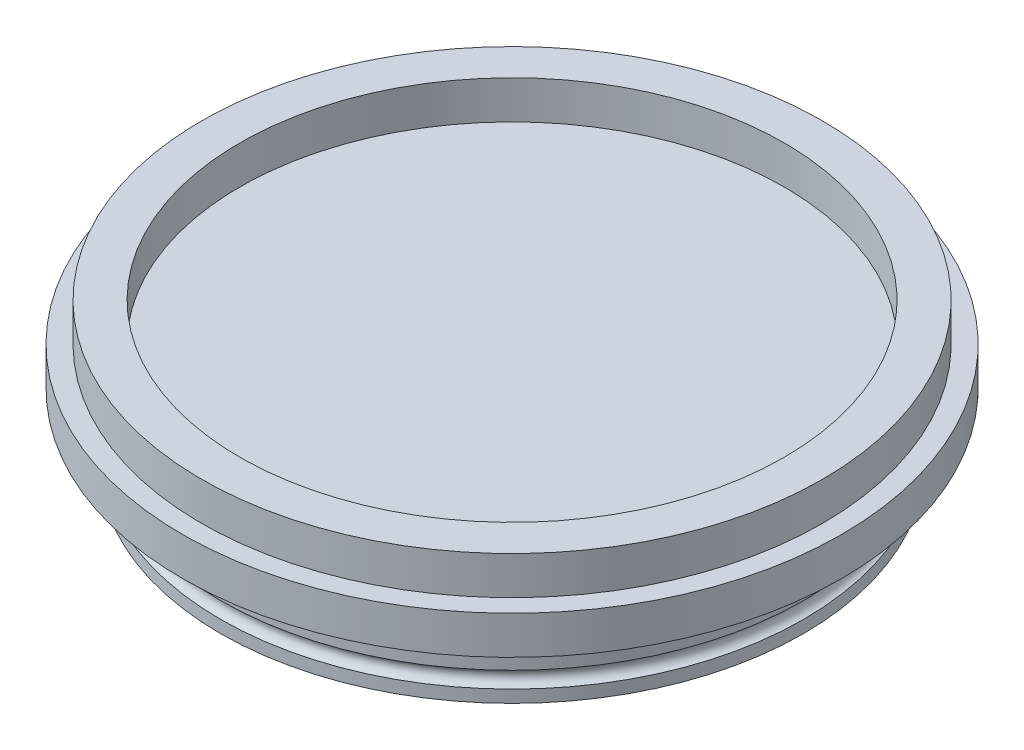
ISO-10303-21;
HEADER;
FILE_DESCRIPTION(('STEP AP214'),'2;1');
FILE_NAME('part.step','',(''),(''),'','','');
FILE_SCHEMA(('AUTOMOTIVE_DESIGN { 1 0 10303 214 1 1 1 1 }'));
ENDSEC;
DATA;
#1=APPLICATION_CONTEXT('core data for automotive mechanical design processes');
#2=APPLICATION_PROTOCOL_DEFINITION('international standard','automotive_design',2000,#1);
#3=PRODUCT_CONTEXT('',#1,'mechanical');
#4=PRODUCT('Part','Part','',(#3));
#5=PRODUCT_RELATED_PRODUCT_CATEGORY('part','',(#4));
#6=PRODUCT_DEFINITION_FORMATION('','',#4);
#7=PRODUCT_DEFINITION_CONTEXT('part definition',#1,'design');
#8=PRODUCT_DEFINITION('design','',#6,#7);
#9=PRODUCT_DEFINITION_SHAPE('','',#8);
#10=(LENGTH_UNIT() NAMED_UNIT(*) SI_UNIT(.MILLI.,.METRE.));
#11=(NAMED_UNIT(*) PLANE_ANGLE_UNIT() SI_UNIT($,.RADIAN.));
#12=(NAMED_UNIT(*) SI_UNIT($,.STERADIAN.) SOLID_ANGLE_UNIT());
#13=UNCERTAINTY_MEASURE_WITH_UNIT(LENGTH_MEASURE(1.E-05),#10,'distance_accuracy_value','');
#14=(GEOMETRIC_REPRESENTATION_CONTEXT(3) GLOBAL_UNCERTAINTY_ASSIGNED_CONTEXT((#13)) GLOBAL_UNIT_ASSIGNED_CONTEXT((#10,
#11,#12)) REPRESENTATION_CONTEXT('',''));
#15=CARTESIAN_POINT('',(0.,0.,0.));
#16=DIRECTION('',(0.,0.,1.));
#17=DIRECTION('',(1.,0.,0.));
#18=AXIS2_PLACEMENT_3D('',#15,#16,#17);
#19=CARTESIAN_POINT('',(0.,0.,0.));
#20=DIRECTION('',(0.,-1.,0.));
#21=DIRECTION('',(1.,0.,0.));
#22=AXIS2_PLACEMENT_3D('',#19,#20,#21);
#23=CYLINDRICAL_SURFACE('',#22,109.5375);
#24=CARTESIAN_POINT('',(0.,3276.6,0.));
#25=DIRECTION('',(0.,-1.,0.));
#26=DIRECTION('',(1.,0.,0.));
#27=AXIS2_PLACEMENT_3D('',#24,#25,#26);
#28=CIRCLE('',#27,109.5375);
#29=CARTESIAN_POINT('',(109.5375,3276.6,0.));
#30=VERTEX_POINT('',#29);
#31=EDGE_CURVE('E64',#30,#30,#28,.T.);
#32=ORIENTED_EDGE('',*,*,#31,.F.);
#33=EDGE_LOOP('',(#32));
#34=FACE_BOUND('',#33,.T.);
#35=CARTESIAN_POINT('',(0.,3289.3,0.));
#36=DIRECTION('',(0.,-1.,0.));
#37=DIRECTION('',(1.,0.,0.));
#38=AXIS2_PLACEMENT_3D('',#35,#36,#37);
#39=CIRCLE('',#38,109.5375);
#40=CARTESIAN_POINT('',(109.5375,3289.3,0.));
#41=VERTEX_POINT('',#40);
#42=EDGE_CURVE('E10',#41,#41,#39,.T.);
#43=ORIENTED_EDGE('',*,*,#42,.T.);
#44=EDGE_LOOP('',(#43));
#45=FACE_BOUND('',#44,.T.);
#46=ADVANCED_FACE('F30',(#34,#45),#23,.T.);
#47=CARTESIAN_POINT('',(-109.5375,3289.3,0.));
#48=DIRECTION('',(0.,-1.,0.));
#49=DIRECTION('',(1.,0.,0.));
#50=AXIS2_PLACEMENT_3D('',#47,#48,#49);
#51=PLANE('',#50);
#52=ORIENTED_EDGE('',*,*,#42,.F.);
#53=EDGE_LOOP('',(#52));
#54=FACE_BOUND('',#53,.T.);
#55=CARTESIAN_POINT('',(0.,3289.3,0.));
#56=DIRECTION('',(0.,-1.,0.));
#57=DIRECTION('',(1.,0.,0.));
#58=AXIS2_PLACEMENT_3D('',#55,#56,#57);
#59=CIRCLE('',#58,103.1875);
#60=CARTESIAN_POINT('',(103.1875,3289.3,0.));
#61=VERTEX_POINT('',#60);
#62=EDGE_CURVE('E36',#61,#61,#59,.T.);
#63=ORIENTED_EDGE('',*,*,#62,.T.);
#64=EDGE_LOOP('',(#63));
#65=FACE_BOUND('',#64,.T.);
#66=ADVANCED_FACE('F71',(#54,#65),#51,.F.);
#67=CARTESIAN_POINT('',(0.,0.,0.));
#68=DIRECTION('',(0.,-1.,0.));
#69=DIRECTION('',(1.,0.,0.));
#70=AXIS2_PLACEMENT_3D('',#67,#68,#69);
#71=CYLINDRICAL_SURFACE('',#70,103.1875);
#72=ORIENTED_EDGE('',*,*,#62,.F.);
#73=EDGE_LOOP('',(#72));
#74=FACE_BOUND('',#73,.T.);
#75=CARTESIAN_POINT('',(0.,3302.,0.));
#76=DIRECTION('',(0.,-1.,0.));
#77=DIRECTION('',(1.,0.,0.));
#78=AXIS2_PLACEMENT_3D('',#75,#76,#77);
#79=CIRCLE('',#78,103.1875);
#80=CARTESIAN_POINT('',(103.1875,3302.,0.));
#81=VERTEX_POINT('',#80);
#82=EDGE_CURVE('E40',#81,#81,#79,.T.);
#83=ORIENTED_EDGE('',*,*,#82,.T.);
#84=EDGE_LOOP('',(#83));
#85=FACE_BOUND('',#84,.T.);
#86=ADVANCED_FACE('F75',(#74,#85),#71,.T.);
#87=CARTESIAN_POINT('',(-103.1875,3302.,0.));
#88=DIRECTION('',(0.,-1.,0.));
#89=DIRECTION('',(1.,0.,0.));
#90=AXIS2_PLACEMENT_3D('',#87,#88,#89);
#91=PLANE('',#90);
#92=ORIENTED_EDGE('',*,*,#82,.F.);
#93=EDGE_LOOP('',(#92));
#94=FACE_BOUND('',#93,.T.);
#95=CARTESIAN_POINT('',(0.,3302.,0.));
#96=DIRECTION('',(0.,-1.,0.));
#97=DIRECTION('',(1.,0.,0.));
#98=AXIS2_PLACEMENT_3D('',#95,#96,#97);
#99=CIRCLE('',#98,90.4875000000004);
#100=CARTESIAN_POINT('',(90.4875000000004,3302.,0.));
#101=VERTEX_POINT('',#100);
#102=EDGE_CURVE('E44',#101,#101,#99,.T.);
#103=ORIENTED_EDGE('',*,*,#102,.T.);
#104=EDGE_LOOP('',(#103));
#105=FACE_BOUND('',#104,.T.);
#106=ADVANCED_FACE('F80',(#94,#105),#91,.F.);
#107=CARTESIAN_POINT('',(0.,0.,0.));
#108=DIRECTION('',(0.,-1.,0.));
#109=DIRECTION('',(1.,0.,0.));
#110=AXIS2_PLACEMENT_3D('',#107,#108,#109);
#111=CYLINDRICAL_SURFACE('',#110,90.4875000000004);
#112=ORIENTED_EDGE('',*,*,#102,.F.);
#113=EDGE_LOOP('',(#112));
#114=FACE_BOUND('',#113,.T.);
#115=CARTESIAN_POINT('',(0.,3289.3,0.));
#116=DIRECTION('',(0.,-1.,0.));
#117=DIRECTION('',(1.,0.,0.));
#118=AXIS2_PLACEMENT_3D('',#115,#116,#117);
#119=CIRCLE('',#118,90.4875000000004);
#120=CARTESIAN_POINT('',(90.4875000000004,3289.3,0.));
#121=VERTEX_POINT('',#120);
#122=EDGE_CURVE('E49',#121,#121,#119,.T.);
#123=ORIENTED_EDGE('',*,*,#122,.T.);
#124=EDGE_LOOP('',(#123));
#125=FACE_BOUND('',#124,.T.);
#126=ADVANCED_FACE('F86',(#114,#125),#111,.F.);
#127=CARTESIAN_POINT('',(-90.4875000000004,3289.3,0.));
#128=DIRECTION('',(0.,-1.,0.));
#129=DIRECTION('',(1.,0.,0.));
#130=AXIS2_PLACEMENT_3D('',#127,#128,#129);
#131=PLANE('',#130);
#132=ORIENTED_EDGE('',*,*,#122,.F.);
#133=EDGE_LOOP('',(#132));
#134=FACE_BOUND('',#133,.T.);
#135=ADVANCED_FACE('F90',(#134),#131,.F.);
#136=CARTESIAN_POINT('',(-96.8375000000003,3254.375,0.));
#137=DIRECTION('',(0.,1.,0.));
#138=DIRECTION('',(-1.,0.,0.));
#139=AXIS2_PLACEMENT_3D('',#136,#137,#138);
#140=PLANE('',#139);
#141=CARTESIAN_POINT('',(0.,3254.375,0.));
#142=DIRECTION('',(0.,-1.,0.));
#143=DIRECTION('',(1.,0.,0.));
#144=AXIS2_PLACEMENT_3D('',#141,#142,#143);
#145=CIRCLE('',#144,96.8375000000004);
#146=CARTESIAN_POINT('',(96.8375000000004,3254.375,0.));
#147=VERTEX_POINT('',#146);
#148=EDGE_CURVE('E52',#147,#147,#145,.T.);
#149=ORIENTED_EDGE('',*,*,#148,.T.);
#150=EDGE_LOOP('',(#149));
#151=FACE_BOUND('',#150,.T.);
#152=ADVANCED_FACE('F94',(#151),#140,.F.);
#153=CARTESIAN_POINT('',(0.,0.,0.));
#154=DIRECTION('',(0.,-1.,0.));
#155=DIRECTION('',(1.,0.,0.));
#156=AXIS2_PLACEMENT_3D('',#153,#154,#155);
#157=CYLINDRICAL_SURFACE('',#156,96.8375000000004);
#158=ORIENTED_EDGE('',*,*,#148,.F.);
#159=EDGE_LOOP('',(#158));
#160=FACE_BOUND('',#159,.T.);
#161=CARTESIAN_POINT('',(0.,3258.48944226535,0.));
#162=DIRECTION('',(0.,-1.,0.));
#163=DIRECTION('',(1.,0.,0.));
#164=AXIS2_PLACEMENT_3D('',#161,#162,#163);
#165=CIRCLE('',#164,96.8375000000004);
#166=CARTESIAN_POINT('',(96.8375000000004,3258.48944226535,0.));
#167=VERTEX_POINT('',#166);
#168=EDGE_CURVE('E55',#167,#167,#165,.T.);
#169=ORIENTED_EDGE('',*,*,#168,.T.);
#170=EDGE_LOOP('',(#169));
#171=FACE_BOUND('',#170,.T.);
#172=ADVANCED_FACE('F98',(#160,#171),#157,.T.);
#173=CARTESIAN_POINT('',(0.,3261.19472113267,0.));
#174=DIRECTION('',(0.,-1.,0.));
#175=DIRECTION('',(1.,0.,0.));
#176=AXIS2_PLACEMENT_3D('',#173,#174,#175);
#177=TOROIDAL_SURFACE('',#176,97.5360000000004,2.79399999999998);
#178=ORIENTED_EDGE('',*,*,#168,.F.);
#179=EDGE_LOOP('',(#178));
#180=FACE_BOUND('',#179,.T.);
#181=CARTESIAN_POINT('',(0.,3263.9,0.));
#182=DIRECTION('',(0.,-1.,0.));
#183=DIRECTION('',(1.,0.,0.));
#184=AXIS2_PLACEMENT_3D('',#181,#182,#183);
#185=CIRCLE('',#184,96.8375000000004);
#186=CARTESIAN_POINT('',(96.8375000000004,3263.9,0.));
#187=VERTEX_POINT('',#186);
#188=EDGE_CURVE('E58',#187,#187,#185,.T.);
#189=ORIENTED_EDGE('',*,*,#188,.T.);
#190=EDGE_LOOP('',(#189));
#191=FACE_BOUND('',#190,.T.);
#192=ADVANCED_FACE('F102',(#180,#191),#177,.F.);
#193=CARTESIAN_POINT('',(0.,0.,0.));
#194=DIRECTION('',(0.,-1.,0.));
#195=DIRECTION('',(1.,0.,0.));
#196=AXIS2_PLACEMENT_3D('',#193,#194,#195);
#197=CYLINDRICAL_SURFACE('',#196,96.8375000000004);
#198=ORIENTED_EDGE('',*,*,#188,.F.);
#199=EDGE_LOOP('',(#198));
#200=FACE_BOUND('',#199,.T.);
#201=CARTESIAN_POINT('',(0.,3276.6,0.));
#202=DIRECTION('',(0.,-1.,0.));
#203=DIRECTION('',(1.,0.,0.));
#204=AXIS2_PLACEMENT_3D('',#201,#202,#203);
#205=CIRCLE('',#204,96.8375000000004);
#206=CARTESIAN_POINT('',(96.8375000000004,3276.6,0.));
#207=VERTEX_POINT('',#206);
#208=EDGE_CURVE('E61',#207,#207,#205,.T.);
#209=ORIENTED_EDGE('',*,*,#208,.T.);
#210=EDGE_LOOP('',(#209));
#211=FACE_BOUND('',#210,.T.);
#212=ADVANCED_FACE('F106',(#200,#211),#197,.T.);
#213=CARTESIAN_POINT('',(-109.5375,3276.6,0.));
#214=DIRECTION('',(0.,1.,0.));
#215=DIRECTION('',(-1.,0.,0.));
#216=AXIS2_PLACEMENT_3D('',#213,#214,#215);
#217=PLANE('',#216);
#218=ORIENTED_EDGE('',*,*,#208,.F.);
#219=EDGE_LOOP('',(#218));
#220=FACE_BOUND('',#219,.T.);
#221=ORIENTED_EDGE('',*,*,#31,.T.);
#222=EDGE_LOOP('',(#221));
#223=FACE_BOUND('',#222,.T.);
#224=ADVANCED_FACE('F68',(#220,#223),#217,.F.);
#225=CLOSED_SHELL('',(#46,#66,#86,#106,#126,#135,#152,#172,#192,#212,#224));
#226=MANIFOLD_SOLID_BREP('B2',#225);
#227=ADVANCED_BREP_SHAPE_REPRESENTATION('',(#18,#226),#14);
#228=SHAPE_DEFINITION_REPRESENTATION(#9,#227);
ENDSEC;
END-ISO-10303-21;
